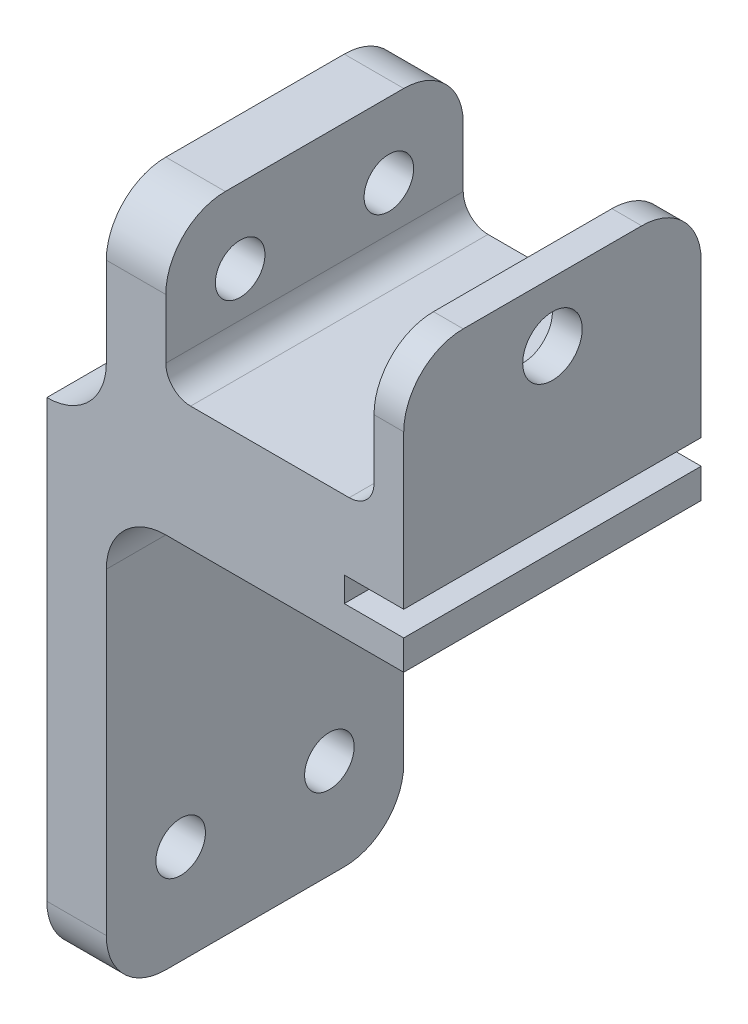
ISO-10303-21;
HEADER;
FILE_DESCRIPTION(('STEP AP214'),'2;1');
FILE_NAME('part.step','',(''),(''),'','','');
FILE_SCHEMA(('AUTOMOTIVE_DESIGN { 1 0 10303 214 1 1 1 1 }'));
ENDSEC;
DATA;
#1=APPLICATION_CONTEXT('core data for automotive mechanical design processes');
#2=APPLICATION_PROTOCOL_DEFINITION('international standard','automotive_design',2000,#1);
#3=PRODUCT_CONTEXT('',#1,'mechanical');
#4=PRODUCT('Part','Part','',(#3));
#5=PRODUCT_RELATED_PRODUCT_CATEGORY('part','',(#4));
#6=PRODUCT_DEFINITION_FORMATION('','',#4);
#7=PRODUCT_DEFINITION_CONTEXT('part definition',#1,'design');
#8=PRODUCT_DEFINITION('design','',#6,#7);
#9=PRODUCT_DEFINITION_SHAPE('','',#8);
#10=(LENGTH_UNIT() NAMED_UNIT(*) SI_UNIT(.MILLI.,.METRE.));
#11=(NAMED_UNIT(*) PLANE_ANGLE_UNIT() SI_UNIT($,.RADIAN.));
#12=(NAMED_UNIT(*) SI_UNIT($,.STERADIAN.) SOLID_ANGLE_UNIT());
#13=UNCERTAINTY_MEASURE_WITH_UNIT(LENGTH_MEASURE(1.E-05),#10,'distance_accuracy_value','');
#14=(GEOMETRIC_REPRESENTATION_CONTEXT(3) GLOBAL_UNCERTAINTY_ASSIGNED_CONTEXT((#13)) GLOBAL_UNIT_ASSIGNED_CONTEXT((#10,
#11,#12)) REPRESENTATION_CONTEXT('',''));
#15=CARTESIAN_POINT('',(0.,0.,0.));
#16=DIRECTION('',(0.,0.,1.));
#17=DIRECTION('',(1.,0.,0.));
#18=AXIS2_PLACEMENT_3D('',#15,#16,#17);
#19=CARTESIAN_POINT('',(0.,-88.,60.));
#20=DIRECTION('',(0.,1.,0.));
#21=DIRECTION('',(0.,0.,1.));
#22=AXIS2_PLACEMENT_3D('',#19,#20,#21);
#23=PLANE('',#22);
#24=DIRECTION('',(0.,0.,-1.));
#25=VECTOR('',#24,1.);
#26=CARTESIAN_POINT('',(-12.,-88.,60.));
#27=LINE('',#26,#25);
#28=CARTESIAN_POINT('',(-12.,-88.,48.));
#29=VERTEX_POINT('',#28);
#30=CARTESIAN_POINT('',(-12.,-88.,12.));
#31=VERTEX_POINT('',#30);
#32=EDGE_CURVE('E280',#29,#31,#27,.T.);
#33=ORIENTED_EDGE('',*,*,#32,.T.);
#34=DIRECTION('',(1.,0.,0.));
#35=VECTOR('',#34,1.);
#36=CARTESIAN_POINT('',(0.,-88.,12.));
#37=LINE('',#36,#35);
#38=CARTESIAN_POINT('',(0.,-88.,12.));
#39=VERTEX_POINT('',#38);
#40=EDGE_CURVE('E403',#31,#39,#37,.T.);
#41=ORIENTED_EDGE('',*,*,#40,.T.);
#42=DIRECTION('',(0.,0.,-1.));
#43=VECTOR('',#42,1.);
#44=CARTESIAN_POINT('',(0.,-88.,60.));
#45=LINE('',#44,#43);
#46=CARTESIAN_POINT('',(0.,-88.,48.));
#47=VERTEX_POINT('',#46);
#48=EDGE_CURVE('E229',#47,#39,#45,.T.);
#49=ORIENTED_EDGE('',*,*,#48,.F.);
#50=DIRECTION('',(1.,0.,0.));
#51=VECTOR('',#50,1.);
#52=CARTESIAN_POINT('',(-12.,-88.,48.));
#53=LINE('',#52,#51);
#54=EDGE_CURVE('E400',#47,#29,#53,.F.);
#55=ORIENTED_EDGE('',*,*,#54,.T.);
#56=EDGE_LOOP('',(#33,#41,#49,#55));
#57=FACE_BOUND('',#56,.T.);
#58=ADVANCED_FACE('F39',(#57),#23,.F.);
#59=CARTESIAN_POINT('',(0.,-12.0000000000001,60.));
#60=DIRECTION('',(-1.,0.,0.));
#61=DIRECTION('',(0.,-1.,0.));
#62=AXIS2_PLACEMENT_3D('',#59,#60,#61);
#63=PLANE('',#62);
#64=CARTESIAN_POINT('',(0.,-68.,45.));
#65=DIRECTION('',(-1.,0.,0.));
#66=DIRECTION('',(0.,-1.,0.));
#67=AXIS2_PLACEMENT_3D('',#64,#65,#66);
#68=CIRCLE('',#67,5.);
#69=CARTESIAN_POINT('',(0.,-73.,45.));
#70=VERTEX_POINT('',#69);
#71=EDGE_CURVE('E823',#70,#70,#68,.F.);
#72=ORIENTED_EDGE('',*,*,#71,.F.);
#73=EDGE_LOOP('',(#72));
#74=FACE_BOUND('',#73,.T.);
#75=CARTESIAN_POINT('',(0.,-68.,15.));
#76=DIRECTION('',(-1.,0.,0.));
#77=DIRECTION('',(0.,-1.,0.));
#78=AXIS2_PLACEMENT_3D('',#75,#76,#77);
#79=CIRCLE('',#78,5.);
#80=CARTESIAN_POINT('',(0.,-73.,15.));
#81=VERTEX_POINT('',#80);
#82=EDGE_CURVE('E284',#81,#81,#79,.F.);
#83=ORIENTED_EDGE('',*,*,#82,.F.);
#84=EDGE_LOOP('',(#83));
#85=FACE_BOUND('',#84,.T.);
#86=ORIENTED_EDGE('',*,*,#48,.T.);
#87=CARTESIAN_POINT('',(0.,-76.,12.));
#88=DIRECTION('',(-1.,0.,0.));
#89=DIRECTION('',(0.,-1.,0.));
#90=AXIS2_PLACEMENT_3D('',#87,#88,#89);
#91=CIRCLE('',#90,12.);
#92=CARTESIAN_POINT('',(0.,-76.,0.));
#93=VERTEX_POINT('',#92);
#94=EDGE_CURVE('E410',#39,#93,#91,.F.);
#95=ORIENTED_EDGE('',*,*,#94,.T.);
#96=DIRECTION('',(0.,1.,0.));
#97=VECTOR('',#96,1.);
#98=CARTESIAN_POINT('',(0.,-12.0000000000001,0.));
#99=LINE('',#98,#97);
#100=CARTESIAN_POINT('',(0.,-12.0000000000001,0.));
#101=VERTEX_POINT('',#100);
#102=EDGE_CURVE('E225',#93,#101,#99,.T.);
#103=ORIENTED_EDGE('',*,*,#102,.T.);
#104=DIRECTION('',(0.,0.,-1.));
#105=VECTOR('',#104,1.);
#106=CARTESIAN_POINT('',(0.,-12.0000000000001,60.));
#107=LINE('',#106,#105);
#108=CARTESIAN_POINT('',(0.,-12.0000000000001,60.));
#109=VERTEX_POINT('',#108);
#110=EDGE_CURVE('E221',#109,#101,#107,.T.);
#111=ORIENTED_EDGE('',*,*,#110,.F.);
#112=DIRECTION('',(0.,1.,0.));
#113=VECTOR('',#112,1.);
#114=CARTESIAN_POINT('',(0.,-12.0000000000001,60.));
#115=LINE('',#114,#113);
#116=CARTESIAN_POINT('',(0.,-76.,60.));
#117=VERTEX_POINT('',#116);
#118=EDGE_CURVE('E207',#117,#109,#115,.T.);
#119=ORIENTED_EDGE('',*,*,#118,.F.);
#120=CARTESIAN_POINT('',(0.,-76.,48.));
#121=DIRECTION('',(-1.,0.,0.));
#122=DIRECTION('',(0.,-1.,0.));
#123=AXIS2_PLACEMENT_3D('',#120,#121,#122);
#124=CIRCLE('',#123,12.);
#125=EDGE_CURVE('E407',#117,#47,#124,.F.);
#126=ORIENTED_EDGE('',*,*,#125,.T.);
#127=EDGE_LOOP('',(#86,#95,#103,#111,#119,#126));
#128=FACE_BOUND('',#127,.T.);
#129=ADVANCED_FACE('F223',(#74,#85,#128),#63,.F.);
#130=CARTESIAN_POINT('',(12.,-12.,60.));
#131=DIRECTION('',(0.,0.,-1.));
#132=DIRECTION('',(-1.,0.,0.));
#133=AXIS2_PLACEMENT_3D('',#130,#131,#132);
#134=CYLINDRICAL_SURFACE('',#133,12.);
#135=CARTESIAN_POINT('',(12.,-12.,0.));
#136=DIRECTION('',(0.,0.,-1.));
#137=DIRECTION('',(-1.,0.,0.));
#138=AXIS2_PLACEMENT_3D('',#135,#136,#137);
#139=CIRCLE('',#138,12.);
#140=CARTESIAN_POINT('',(12.0000000000001,0.,0.));
#141=VERTEX_POINT('',#140);
#142=EDGE_CURVE('E283',#101,#141,#139,.T.);
#143=ORIENTED_EDGE('',*,*,#142,.T.);
#144=DIRECTION('',(0.,0.,-1.));
#145=VECTOR('',#144,1.);
#146=CARTESIAN_POINT('',(12.0000000000001,0.,60.));
#147=LINE('',#146,#145);
#148=CARTESIAN_POINT('',(12.0000000000001,0.,60.));
#149=VERTEX_POINT('',#148);
#150=EDGE_CURVE('E230',#149,#141,#147,.T.);
#151=ORIENTED_EDGE('',*,*,#150,.F.);
#152=CARTESIAN_POINT('',(12.,-12.,60.));
#153=DIRECTION('',(0.,0.,-1.));
#154=DIRECTION('',(-1.,0.,0.));
#155=AXIS2_PLACEMENT_3D('',#152,#153,#154);
#156=CIRCLE('',#155,12.);
#157=EDGE_CURVE('E212',#109,#149,#156,.T.);
#158=ORIENTED_EDGE('',*,*,#157,.F.);
#159=ORIENTED_EDGE('',*,*,#110,.T.);
#160=EDGE_LOOP('',(#143,#151,#158,#159));
#161=FACE_BOUND('',#160,.T.);
#162=ADVANCED_FACE('F232',(#161),#134,.F.);
#163=CARTESIAN_POINT('',(60.,0.,60.));
#164=DIRECTION('',(0.,1.,0.));
#165=DIRECTION('',(0.,0.,1.));
#166=AXIS2_PLACEMENT_3D('',#163,#164,#165);
#167=PLANE('',#166);
#168=DIRECTION('',(1.,0.,0.));
#169=VECTOR('',#168,1.);
#170=CARTESIAN_POINT('',(60.,0.,0.));
#171=LINE('',#170,#169);
#172=CARTESIAN_POINT('',(60.,0.,0.));
#173=VERTEX_POINT('',#172);
#174=EDGE_CURVE('E287',#141,#173,#171,.T.);
#175=ORIENTED_EDGE('',*,*,#174,.T.);
#176=DIRECTION('',(0.,0.,-1.));
#177=VECTOR('',#176,1.);
#178=CARTESIAN_POINT('',(60.,0.,60.));
#179=LINE('',#178,#177);
#180=CARTESIAN_POINT('',(60.,0.,60.));
#181=VERTEX_POINT('',#180);
#182=EDGE_CURVE('E381',#181,#173,#179,.T.);
#183=ORIENTED_EDGE('',*,*,#182,.F.);
#184=DIRECTION('',(1.,0.,0.));
#185=VECTOR('',#184,1.);
#186=CARTESIAN_POINT('',(60.,0.,60.));
#187=LINE('',#186,#185);
#188=EDGE_CURVE('E236',#149,#181,#187,.T.);
#189=ORIENTED_EDGE('',*,*,#188,.F.);
#190=ORIENTED_EDGE('',*,*,#150,.T.);
#191=EDGE_LOOP('',(#175,#183,#189,#190));
#192=FACE_BOUND('',#191,.T.);
#193=ADVANCED_FACE('F512',(#192),#167,.F.);
#194=CARTESIAN_POINT('',(60.,6.,60.));
#195=DIRECTION('',(-1.,0.,0.));
#196=DIRECTION('',(0.,-1.,0.));
#197=AXIS2_PLACEMENT_3D('',#194,#195,#196);
#198=PLANE('',#197);
#199=DIRECTION('',(0.,1.,0.));
#200=VECTOR('',#199,1.);
#201=CARTESIAN_POINT('',(60.,6.,0.));
#202=LINE('',#201,#200);
#203=CARTESIAN_POINT('',(60.,6.,0.));
#204=VERTEX_POINT('',#203);
#205=EDGE_CURVE('E290',#173,#204,#202,.T.);
#206=ORIENTED_EDGE('',*,*,#205,.T.);
#207=DIRECTION('',(0.,0.,-1.));
#208=VECTOR('',#207,1.);
#209=CARTESIAN_POINT('',(60.,6.,60.));
#210=LINE('',#209,#208);
#211=CARTESIAN_POINT('',(60.,6.,60.));
#212=VERTEX_POINT('',#211);
#213=EDGE_CURVE('E377',#212,#204,#210,.T.);
#214=ORIENTED_EDGE('',*,*,#213,.F.);
#215=DIRECTION('',(0.,1.,0.));
#216=VECTOR('',#215,1.);
#217=CARTESIAN_POINT('',(60.,6.,60.));
#218=LINE('',#217,#216);
#219=EDGE_CURVE('E239',#181,#212,#218,.T.);
#220=ORIENTED_EDGE('',*,*,#219,.F.);
#221=ORIENTED_EDGE('',*,*,#182,.T.);
#222=EDGE_LOOP('',(#206,#214,#220,#221));
#223=FACE_BOUND('',#222,.T.);
#224=ADVANCED_FACE('F519',(#223),#198,.F.);
#225=CARTESIAN_POINT('',(48.,6.,60.));
#226=DIRECTION('',(0.,-1.,0.));
#227=DIRECTION('',(0.,0.,-1.));
#228=AXIS2_PLACEMENT_3D('',#225,#226,#227);
#229=PLANE('',#228);
#230=DIRECTION('',(-1.,0.,0.));
#231=VECTOR('',#230,1.);
#232=CARTESIAN_POINT('',(48.,6.,0.));
#233=LINE('',#232,#231);
#234=CARTESIAN_POINT('',(48.,6.,0.));
#235=VERTEX_POINT('',#234);
#236=EDGE_CURVE('E293',#204,#235,#233,.T.);
#237=ORIENTED_EDGE('',*,*,#236,.T.);
#238=DIRECTION('',(0.,0.,-1.));
#239=VECTOR('',#238,1.);
#240=CARTESIAN_POINT('',(48.,6.,60.));
#241=LINE('',#240,#239);
#242=CARTESIAN_POINT('',(48.,6.,60.));
#243=VERTEX_POINT('',#242);
#244=EDGE_CURVE('E373',#243,#235,#241,.T.);
#245=ORIENTED_EDGE('',*,*,#244,.F.);
#246=DIRECTION('',(-1.,0.,0.));
#247=VECTOR('',#246,1.);
#248=CARTESIAN_POINT('',(48.,6.,60.));
#249=LINE('',#248,#247);
#250=EDGE_CURVE('E245',#212,#243,#249,.T.);
#251=ORIENTED_EDGE('',*,*,#250,.F.);
#252=ORIENTED_EDGE('',*,*,#213,.T.);
#253=EDGE_LOOP('',(#237,#245,#251,#252));
#254=FACE_BOUND('',#253,.T.);
#255=ADVANCED_FACE('F522',(#254),#229,.F.);
#256=CARTESIAN_POINT('',(48.,11.,60.));
#257=DIRECTION('',(-1.,0.,0.));
#258=DIRECTION('',(0.,-1.,0.));
#259=AXIS2_PLACEMENT_3D('',#256,#257,#258);
#260=PLANE('',#259);
#261=DIRECTION('',(0.,1.,0.));
#262=VECTOR('',#261,1.);
#263=CARTESIAN_POINT('',(48.,11.,0.));
#264=LINE('',#263,#262);
#265=CARTESIAN_POINT('',(48.,11.,0.));
#266=VERTEX_POINT('',#265);
#267=EDGE_CURVE('E296',#235,#266,#264,.T.);
#268=ORIENTED_EDGE('',*,*,#267,.T.);
#269=DIRECTION('',(0.,0.,-1.));
#270=VECTOR('',#269,1.);
#271=CARTESIAN_POINT('',(48.,11.,60.));
#272=LINE('',#271,#270);
#273=CARTESIAN_POINT('',(48.,11.,60.));
#274=VERTEX_POINT('',#273);
#275=EDGE_CURVE('E369',#274,#266,#272,.T.);
#276=ORIENTED_EDGE('',*,*,#275,.F.);
#277=DIRECTION('',(0.,1.,0.));
#278=VECTOR('',#277,1.);
#279=CARTESIAN_POINT('',(48.,11.,60.));
#280=LINE('',#279,#278);
#281=EDGE_CURVE('E248',#243,#274,#280,.T.);
#282=ORIENTED_EDGE('',*,*,#281,.F.);
#283=ORIENTED_EDGE('',*,*,#244,.T.);
#284=EDGE_LOOP('',(#268,#276,#282,#283));
#285=FACE_BOUND('',#284,.T.);
#286=ADVANCED_FACE('F527',(#285),#260,.F.);
#287=CARTESIAN_POINT('',(60.,11.,60.));
#288=DIRECTION('',(0.,1.,0.));
#289=DIRECTION('',(-1.,0.,0.));
#290=AXIS2_PLACEMENT_3D('',#287,#288,#289);
#291=PLANE('',#290);
#292=DIRECTION('',(1.,0.,0.));
#293=VECTOR('',#292,1.);
#294=CARTESIAN_POINT('',(60.,11.,0.));
#295=LINE('',#294,#293);
#296=CARTESIAN_POINT('',(60.,11.,0.));
#297=VERTEX_POINT('',#296);
#298=EDGE_CURVE('E299',#266,#297,#295,.T.);
#299=ORIENTED_EDGE('',*,*,#298,.T.);
#300=DIRECTION('',(0.,0.,-1.));
#301=VECTOR('',#300,1.);
#302=CARTESIAN_POINT('',(60.,11.,60.));
#303=LINE('',#302,#301);
#304=CARTESIAN_POINT('',(60.,11.,60.));
#305=VERTEX_POINT('',#304);
#306=EDGE_CURVE('E365',#305,#297,#303,.T.);
#307=ORIENTED_EDGE('',*,*,#306,.F.);
#308=DIRECTION('',(1.,0.,0.));
#309=VECTOR('',#308,1.);
#310=CARTESIAN_POINT('',(60.,11.,60.));
#311=LINE('',#310,#309);
#312=EDGE_CURVE('E251',#274,#305,#311,.T.);
#313=ORIENTED_EDGE('',*,*,#312,.F.);
#314=ORIENTED_EDGE('',*,*,#275,.T.);
#315=EDGE_LOOP('',(#299,#307,#313,#314));
#316=FACE_BOUND('',#315,.T.);
#317=ADVANCED_FACE('F533',(#316),#291,.F.);
#318=CARTESIAN_POINT('',(60.,54.,60.));
#319=DIRECTION('',(-1.,0.,0.));
#320=DIRECTION('',(0.,-1.,0.));
#321=AXIS2_PLACEMENT_3D('',#318,#319,#320);
#322=PLANE('',#321);
#323=CARTESIAN_POINT('',(60.,42.,30.));
#324=DIRECTION('',(1.,0.,0.));
#325=DIRECTION('',(0.,1.,0.));
#326=AXIS2_PLACEMENT_3D('',#323,#324,#325);
#327=CIRCLE('',#326,6.);
#328=CARTESIAN_POINT('',(60.,48.,30.));
#329=VERTEX_POINT('',#328);
#330=EDGE_CURVE('E816',#329,#329,#327,.T.);
#331=ORIENTED_EDGE('',*,*,#330,.F.);
#332=EDGE_LOOP('',(#331));
#333=FACE_BOUND('',#332,.T.);
#334=DIRECTION('',(0.,1.,0.));
#335=VECTOR('',#334,1.);
#336=CARTESIAN_POINT('',(60.,54.,0.));
#337=LINE('',#336,#335);
#338=CARTESIAN_POINT('',(60.,42.,0.));
#339=VERTEX_POINT('',#338);
#340=EDGE_CURVE('E302',#297,#339,#337,.T.);
#341=ORIENTED_EDGE('',*,*,#340,.T.);
#342=CARTESIAN_POINT('',(60.,42.,12.));
#343=DIRECTION('',(-1.,0.,0.));
#344=DIRECTION('',(0.,-1.,0.));
#345=AXIS2_PLACEMENT_3D('',#342,#343,#344);
#346=CIRCLE('',#345,12.);
#347=CARTESIAN_POINT('',(60.,54.,12.));
#348=VERTEX_POINT('',#347);
#349=EDGE_CURVE('E454',#339,#348,#346,.F.);
#350=ORIENTED_EDGE('',*,*,#349,.T.);
#351=DIRECTION('',(0.,0.,-1.));
#352=VECTOR('',#351,1.);
#353=CARTESIAN_POINT('',(60.,54.,60.));
#354=LINE('',#353,#352);
#355=CARTESIAN_POINT('',(60.,54.,48.));
#356=VERTEX_POINT('',#355);
#357=EDGE_CURVE('E361',#356,#348,#354,.T.);
#358=ORIENTED_EDGE('',*,*,#357,.F.);
#359=CARTESIAN_POINT('',(60.,42.,48.));
#360=DIRECTION('',(-1.,0.,0.));
#361=DIRECTION('',(0.,-1.,0.));
#362=AXIS2_PLACEMENT_3D('',#359,#360,#361);
#363=CIRCLE('',#362,12.);
#364=CARTESIAN_POINT('',(60.,42.,60.));
#365=VERTEX_POINT('',#364);
#366=EDGE_CURVE('E451',#356,#365,#363,.F.);
#367=ORIENTED_EDGE('',*,*,#366,.T.);
#368=DIRECTION('',(0.,1.,0.));
#369=VECTOR('',#368,1.);
#370=CARTESIAN_POINT('',(60.,54.,60.));
#371=LINE('',#370,#369);
#372=EDGE_CURVE('E254',#305,#365,#371,.T.);
#373=ORIENTED_EDGE('',*,*,#372,.F.);
#374=ORIENTED_EDGE('',*,*,#306,.T.);
#375=EDGE_LOOP('',(#341,#350,#358,#367,#373,#374));
#376=FACE_BOUND('',#375,.T.);
#377=ADVANCED_FACE('F537',(#333,#376),#322,.F.);
#378=CARTESIAN_POINT('',(54.,54.,60.));
#379=DIRECTION('',(0.,-1.,0.));
#380=DIRECTION('',(0.,0.,-1.));
#381=AXIS2_PLACEMENT_3D('',#378,#379,#380);
#382=PLANE('',#381);
#383=ORIENTED_EDGE('',*,*,#357,.T.);
#384=DIRECTION('',(-1.,0.,0.));
#385=VECTOR('',#384,1.);
#386=CARTESIAN_POINT('',(54.,54.,12.));
#387=LINE('',#386,#385);
#388=CARTESIAN_POINT('',(54.,54.,12.));
#389=VERTEX_POINT('',#388);
#390=EDGE_CURVE('E441',#348,#389,#387,.T.);
#391=ORIENTED_EDGE('',*,*,#390,.T.);
#392=DIRECTION('',(0.,0.,-1.));
#393=VECTOR('',#392,1.);
#394=CARTESIAN_POINT('',(54.,54.,60.));
#395=LINE('',#394,#393);
#396=CARTESIAN_POINT('',(54.,54.,48.));
#397=VERTEX_POINT('',#396);
#398=EDGE_CURVE('E357',#397,#389,#395,.T.);
#399=ORIENTED_EDGE('',*,*,#398,.F.);
#400=DIRECTION('',(-1.,0.,0.));
#401=VECTOR('',#400,1.);
#402=CARTESIAN_POINT('',(60.,54.,48.));
#403=LINE('',#402,#401);
#404=EDGE_CURVE('E438',#397,#356,#403,.F.);
#405=ORIENTED_EDGE('',*,*,#404,.T.);
#406=EDGE_LOOP('',(#383,#391,#399,#405));
#407=FACE_BOUND('',#406,.T.);
#408=ADVANCED_FACE('F568',(#407),#382,.F.);
#409=CARTESIAN_POINT('',(54.,30.,60.));
#410=DIRECTION('',(1.,0.,0.));
#411=DIRECTION('',(0.,1.,0.));
#412=AXIS2_PLACEMENT_3D('',#409,#410,#411);
#413=PLANE('',#412);
#414=CARTESIAN_POINT('',(54.,42.,30.));
#415=DIRECTION('',(1.,0.,0.));
#416=DIRECTION('',(0.,1.,0.));
#417=AXIS2_PLACEMENT_3D('',#414,#415,#416);
#418=CIRCLE('',#417,6.);
#419=CARTESIAN_POINT('',(54.,48.,30.));
#420=VERTEX_POINT('',#419);
#421=EDGE_CURVE('E813',#420,#420,#418,.F.);
#422=ORIENTED_EDGE('',*,*,#421,.F.);
#423=EDGE_LOOP('',(#422));
#424=FACE_BOUND('',#423,.T.);
#425=ORIENTED_EDGE('',*,*,#398,.T.);
#426=CARTESIAN_POINT('',(54.,42.,12.));
#427=DIRECTION('',(1.,0.,0.));
#428=DIRECTION('',(0.,1.,0.));
#429=AXIS2_PLACEMENT_3D('',#426,#427,#428);
#430=CIRCLE('',#429,12.);
#431=CARTESIAN_POINT('',(54.,42.,0.));
#432=VERTEX_POINT('',#431);
#433=EDGE_CURVE('E448',#389,#432,#430,.F.);
#434=ORIENTED_EDGE('',*,*,#433,.T.);
#435=DIRECTION('',(0.,-1.,0.));
#436=VECTOR('',#435,1.);
#437=CARTESIAN_POINT('',(54.,30.,0.));
#438=LINE('',#437,#436);
#439=CARTESIAN_POINT('',(54.,30.,0.));
#440=VERTEX_POINT('',#439);
#441=EDGE_CURVE('E306',#432,#440,#438,.T.);
#442=ORIENTED_EDGE('',*,*,#441,.T.);
#443=DIRECTION('',(0.,0.,-1.));
#444=VECTOR('',#443,1.);
#445=CARTESIAN_POINT('',(54.,30.,60.));
#446=LINE('',#445,#444);
#447=CARTESIAN_POINT('',(54.,30.,60.));
#448=VERTEX_POINT('',#447);
#449=EDGE_CURVE('E353',#448,#440,#446,.T.);
#450=ORIENTED_EDGE('',*,*,#449,.F.);
#451=DIRECTION('',(0.,-1.,0.));
#452=VECTOR('',#451,1.);
#453=CARTESIAN_POINT('',(54.,30.,60.));
#454=LINE('',#453,#452);
#455=CARTESIAN_POINT('',(54.,42.,60.));
#456=VERTEX_POINT('',#455);
#457=EDGE_CURVE('E258',#456,#448,#454,.T.);
#458=ORIENTED_EDGE('',*,*,#457,.F.);
#459=CARTESIAN_POINT('',(54.,42.,48.));
#460=DIRECTION('',(1.,0.,0.));
#461=DIRECTION('',(0.,1.,0.));
#462=AXIS2_PLACEMENT_3D('',#459,#460,#461);
#463=CIRCLE('',#462,12.);
#464=EDGE_CURVE('E445',#456,#397,#463,.F.);
#465=ORIENTED_EDGE('',*,*,#464,.T.);
#466=EDGE_LOOP('',(#425,#434,#442,#450,#458,#465));
#467=FACE_BOUND('',#466,.T.);
#468=ADVANCED_FACE('F546',(#424,#467),#413,.F.);
#469=CARTESIAN_POINT('',(49.,30.,60.));
#470=DIRECTION('',(0.,0.,-1.));
#471=DIRECTION('',(-1.,0.,0.));
#472=AXIS2_PLACEMENT_3D('',#469,#470,#471);
#473=CYLINDRICAL_SURFACE('',#472,5.);
#474=CARTESIAN_POINT('',(49.,30.,0.));
#475=DIRECTION('',(0.,0.,-1.));
#476=DIRECTION('',(1.,0.,0.));
#477=AXIS2_PLACEMENT_3D('',#474,#475,#476);
#478=CIRCLE('',#477,5.);
#479=CARTESIAN_POINT('',(49.,25.,0.));
#480=VERTEX_POINT('',#479);
#481=EDGE_CURVE('E309',#440,#480,#478,.T.);
#482=ORIENTED_EDGE('',*,*,#481,.T.);
#483=DIRECTION('',(0.,0.,-1.));
#484=VECTOR('',#483,1.);
#485=CARTESIAN_POINT('',(49.,25.,60.));
#486=LINE('',#485,#484);
#487=CARTESIAN_POINT('',(49.,25.,60.));
#488=VERTEX_POINT('',#487);
#489=EDGE_CURVE('E349',#488,#480,#486,.T.);
#490=ORIENTED_EDGE('',*,*,#489,.F.);
#491=CARTESIAN_POINT('',(49.,30.,60.));
#492=DIRECTION('',(0.,0.,-1.));
#493=DIRECTION('',(1.,0.,0.));
#494=AXIS2_PLACEMENT_3D('',#491,#492,#493);
#495=CIRCLE('',#494,5.);
#496=EDGE_CURVE('E261',#448,#488,#495,.T.);
#497=ORIENTED_EDGE('',*,*,#496,.F.);
#498=ORIENTED_EDGE('',*,*,#449,.T.);
#499=EDGE_LOOP('',(#482,#490,#497,#498));
#500=FACE_BOUND('',#499,.T.);
#501=ADVANCED_FACE('F553',(#500),#473,.F.);
#502=CARTESIAN_POINT('',(17.,25.,60.));
#503=DIRECTION('',(0.,-1.,0.));
#504=DIRECTION('',(1.,0.,0.));
#505=AXIS2_PLACEMENT_3D('',#502,#503,#504);
#506=PLANE('',#505);
#507=DIRECTION('',(-1.,0.,0.));
#508=VECTOR('',#507,1.);
#509=CARTESIAN_POINT('',(17.,25.,0.));
#510=LINE('',#509,#508);
#511=CARTESIAN_POINT('',(17.,25.,0.));
#512=VERTEX_POINT('',#511);
#513=EDGE_CURVE('E312',#480,#512,#510,.T.);
#514=ORIENTED_EDGE('',*,*,#513,.T.);
#515=DIRECTION('',(0.,0.,-1.));
#516=VECTOR('',#515,1.);
#517=CARTESIAN_POINT('',(17.,25.,60.));
#518=LINE('',#517,#516);
#519=CARTESIAN_POINT('',(17.,25.,60.));
#520=VERTEX_POINT('',#519);
#521=EDGE_CURVE('E345',#520,#512,#518,.T.);
#522=ORIENTED_EDGE('',*,*,#521,.F.);
#523=DIRECTION('',(-1.,0.,0.));
#524=VECTOR('',#523,1.);
#525=CARTESIAN_POINT('',(17.,25.,60.));
#526=LINE('',#525,#524);
#527=EDGE_CURVE('E264',#488,#520,#526,.T.);
#528=ORIENTED_EDGE('',*,*,#527,.F.);
#529=ORIENTED_EDGE('',*,*,#489,.T.);
#530=EDGE_LOOP('',(#514,#522,#528,#529));
#531=FACE_BOUND('',#530,.T.);
#532=ADVANCED_FACE('F557',(#531),#506,.F.);
#533=CARTESIAN_POINT('',(17.,30.,60.));
#534=DIRECTION('',(0.,0.,-1.));
#535=DIRECTION('',(-1.,0.,0.));
#536=AXIS2_PLACEMENT_3D('',#533,#534,#535);
#537=CYLINDRICAL_SURFACE('',#536,5.);
#538=CARTESIAN_POINT('',(17.,30.,0.));
#539=DIRECTION('',(0.,0.,-1.));
#540=DIRECTION('',(1.,0.,0.));
#541=AXIS2_PLACEMENT_3D('',#538,#539,#540);
#542=CIRCLE('',#541,5.);
#543=CARTESIAN_POINT('',(12.,30.,0.));
#544=VERTEX_POINT('',#543);
#545=EDGE_CURVE('E315',#512,#544,#542,.T.);
#546=ORIENTED_EDGE('',*,*,#545,.T.);
#547=DIRECTION('',(0.,0.,-1.));
#548=VECTOR('',#547,1.);
#549=CARTESIAN_POINT('',(12.,30.,60.));
#550=LINE('',#549,#548);
#551=CARTESIAN_POINT('',(12.,30.,60.));
#552=VERTEX_POINT('',#551);
#553=EDGE_CURVE('E341',#552,#544,#550,.T.);
#554=ORIENTED_EDGE('',*,*,#553,.F.);
#555=CARTESIAN_POINT('',(17.,30.,60.));
#556=DIRECTION('',(0.,0.,-1.));
#557=DIRECTION('',(1.,0.,0.));
#558=AXIS2_PLACEMENT_3D('',#555,#556,#557);
#559=CIRCLE('',#558,5.);
#560=EDGE_CURVE('E267',#520,#552,#559,.T.);
#561=ORIENTED_EDGE('',*,*,#560,.F.);
#562=ORIENTED_EDGE('',*,*,#521,.T.);
#563=EDGE_LOOP('',(#546,#554,#561,#562));
#564=FACE_BOUND('',#563,.T.);
#565=ADVANCED_FACE('F561',(#564),#537,.F.);
#566=CARTESIAN_POINT('',(12.,54.,60.));
#567=DIRECTION('',(-1.,0.,0.));
#568=DIRECTION('',(0.,-1.,0.));
#569=AXIS2_PLACEMENT_3D('',#566,#567,#568);
#570=PLANE('',#569);
#571=CARTESIAN_POINT('',(12.,39.,15.));
#572=DIRECTION('',(-1.,0.,0.));
#573=DIRECTION('',(0.,-1.,0.));
#574=AXIS2_PLACEMENT_3D('',#571,#572,#573);
#575=CIRCLE('',#574,5.);
#576=CARTESIAN_POINT('',(12.,34.,15.));
#577=VERTEX_POINT('',#576);
#578=EDGE_CURVE('E811',#577,#577,#575,.F.);
#579=ORIENTED_EDGE('',*,*,#578,.F.);
#580=EDGE_LOOP('',(#579));
#581=FACE_BOUND('',#580,.T.);
#582=CARTESIAN_POINT('',(12.,39.,45.));
#583=DIRECTION('',(-1.,0.,0.));
#584=DIRECTION('',(0.,-1.,0.));
#585=AXIS2_PLACEMENT_3D('',#582,#583,#584);
#586=CIRCLE('',#585,5.);
#587=CARTESIAN_POINT('',(12.,34.,45.));
#588=VERTEX_POINT('',#587);
#589=EDGE_CURVE('E803',#588,#588,#586,.F.);
#590=ORIENTED_EDGE('',*,*,#589,.F.);
#591=EDGE_LOOP('',(#590));
#592=FACE_BOUND('',#591,.T.);
#593=DIRECTION('',(0.,1.,0.));
#594=VECTOR('',#593,1.);
#595=CARTESIAN_POINT('',(12.,54.,0.));
#596=LINE('',#595,#594);
#597=CARTESIAN_POINT('',(12.,42.,0.));
#598=VERTEX_POINT('',#597);
#599=EDGE_CURVE('E318',#544,#598,#596,.T.);
#600=ORIENTED_EDGE('',*,*,#599,.T.);
#601=CARTESIAN_POINT('',(12.,42.,12.));
#602=DIRECTION('',(-1.,0.,0.));
#603=DIRECTION('',(0.,-1.,0.));
#604=AXIS2_PLACEMENT_3D('',#601,#602,#603);
#605=CIRCLE('',#604,12.);
#606=CARTESIAN_POINT('',(12.,54.,12.));
#607=VERTEX_POINT('',#606);
#608=EDGE_CURVE('E11',#598,#607,#605,.F.);
#609=ORIENTED_EDGE('',*,*,#608,.T.);
#610=DIRECTION('',(0.,0.,-1.));
#611=VECTOR('',#610,1.);
#612=CARTESIAN_POINT('',(12.,54.,60.));
#613=LINE('',#612,#611);
#614=CARTESIAN_POINT('',(12.,54.,48.));
#615=VERTEX_POINT('',#614);
#616=EDGE_CURVE('E338',#615,#607,#613,.T.);
#617=ORIENTED_EDGE('',*,*,#616,.F.);
#618=CARTESIAN_POINT('',(12.,42.,48.));
#619=DIRECTION('',(-1.,0.,0.));
#620=DIRECTION('',(0.,-1.,0.));
#621=AXIS2_PLACEMENT_3D('',#618,#619,#620);
#622=CIRCLE('',#621,12.);
#623=CARTESIAN_POINT('',(12.,42.,60.));
#624=VERTEX_POINT('',#623);
#625=EDGE_CURVE('E48',#615,#624,#622,.F.);
#626=ORIENTED_EDGE('',*,*,#625,.T.);
#627=DIRECTION('',(0.,1.,0.));
#628=VECTOR('',#627,1.);
#629=CARTESIAN_POINT('',(12.,54.,60.));
#630=LINE('',#629,#628);
#631=EDGE_CURVE('E270',#552,#624,#630,.T.);
#632=ORIENTED_EDGE('',*,*,#631,.F.);
#633=ORIENTED_EDGE('',*,*,#553,.T.);
#634=EDGE_LOOP('',(#600,#609,#617,#626,#632,#633));
#635=FACE_BOUND('',#634,.T.);
#636=ADVANCED_FACE('F471',(#581,#592,#635),#570,.F.);
#637=CARTESIAN_POINT('',(0.,54.,60.));
#638=DIRECTION('',(0.,-1.,0.));
#639=DIRECTION('',(0.,0.,-1.));
#640=AXIS2_PLACEMENT_3D('',#637,#638,#639);
#641=PLANE('',#640);
#642=ORIENTED_EDGE('',*,*,#616,.T.);
#643=DIRECTION('',(-1.,0.,0.));
#644=VECTOR('',#643,1.);
#645=CARTESIAN_POINT('',(0.,54.,12.));
#646=LINE('',#645,#644);
#647=CARTESIAN_POINT('',(0.,54.,12.));
#648=VERTEX_POINT('',#647);
#649=EDGE_CURVE('E459',#607,#648,#646,.T.);
#650=ORIENTED_EDGE('',*,*,#649,.T.);
#651=DIRECTION('',(0.,0.,-1.));
#652=VECTOR('',#651,1.);
#653=CARTESIAN_POINT('',(0.,54.,60.));
#654=LINE('',#653,#652);
#655=CARTESIAN_POINT('',(0.,54.,48.));
#656=VERTEX_POINT('',#655);
#657=EDGE_CURVE('E334',#656,#648,#654,.T.);
#658=ORIENTED_EDGE('',*,*,#657,.F.);
#659=DIRECTION('',(-1.,0.,0.));
#660=VECTOR('',#659,1.);
#661=CARTESIAN_POINT('',(12.,54.,48.));
#662=LINE('',#661,#660);
#663=EDGE_CURVE('E60',#656,#615,#662,.F.);
#664=ORIENTED_EDGE('',*,*,#663,.T.);
#665=EDGE_LOOP('',(#642,#650,#658,#664));
#666=FACE_BOUND('',#665,.T.);
#667=ADVANCED_FACE('F479',(#666),#641,.F.);
#668=CARTESIAN_POINT('',(0.,12.,60.));
#669=DIRECTION('',(1.,0.,0.));
#670=DIRECTION('',(0.,1.,0.));
#671=AXIS2_PLACEMENT_3D('',#668,#669,#670);
#672=PLANE('',#671);
#673=CARTESIAN_POINT('',(0.,39.,15.));
#674=DIRECTION('',(1.,0.,0.));
#675=DIRECTION('',(0.,1.,0.));
#676=AXIS2_PLACEMENT_3D('',#673,#674,#675);
#677=CIRCLE('',#676,5.);
#678=CARTESIAN_POINT('',(0.,44.,15.));
#679=VERTEX_POINT('',#678);
#680=EDGE_CURVE('E806',#679,#679,#677,.F.);
#681=ORIENTED_EDGE('',*,*,#680,.F.);
#682=EDGE_LOOP('',(#681));
#683=FACE_BOUND('',#682,.T.);
#684=CARTESIAN_POINT('',(0.,39.,45.));
#685=DIRECTION('',(1.,0.,0.));
#686=DIRECTION('',(0.,1.,0.));
#687=AXIS2_PLACEMENT_3D('',#684,#685,#686);
#688=CIRCLE('',#687,5.);
#689=CARTESIAN_POINT('',(0.,44.,45.));
#690=VERTEX_POINT('',#689);
#691=EDGE_CURVE('E800',#690,#690,#688,.F.);
#692=ORIENTED_EDGE('',*,*,#691,.F.);
#693=EDGE_LOOP('',(#692));
#694=FACE_BOUND('',#693,.T.);
#695=ORIENTED_EDGE('',*,*,#657,.T.);
#696=CARTESIAN_POINT('',(0.,42.,12.));
#697=DIRECTION('',(1.,0.,0.));
#698=DIRECTION('',(0.,1.,0.));
#699=AXIS2_PLACEMENT_3D('',#696,#697,#698);
#700=CIRCLE('',#699,12.);
#701=CARTESIAN_POINT('',(0.,42.,0.));
#702=VERTEX_POINT('',#701);
#703=EDGE_CURVE('E466',#648,#702,#700,.F.);
#704=ORIENTED_EDGE('',*,*,#703,.T.);
#705=DIRECTION('',(0.,-1.,0.));
#706=VECTOR('',#705,1.);
#707=CARTESIAN_POINT('',(0.,12.,0.));
#708=LINE('',#707,#706);
#709=CARTESIAN_POINT('',(0.,24.,0.));
#710=VERTEX_POINT('',#709);
#711=EDGE_CURVE('E321',#702,#710,#708,.T.);
#712=ORIENTED_EDGE('',*,*,#711,.T.);
#713=DIRECTION('',(0.,0.,-1.));
#714=VECTOR('',#713,1.);
#715=CARTESIAN_POINT('',(0.,24.,60.));
#716=LINE('',#715,#714);
#717=CARTESIAN_POINT('',(0.,24.,60.));
#718=VERTEX_POINT('',#717);
#719=EDGE_CURVE('E389',#710,#718,#716,.F.);
#720=ORIENTED_EDGE('',*,*,#719,.T.);
#721=DIRECTION('',(0.,-1.,0.));
#722=VECTOR('',#721,1.);
#723=CARTESIAN_POINT('',(0.,12.,60.));
#724=LINE('',#723,#722);
#725=CARTESIAN_POINT('',(0.,42.,60.));
#726=VERTEX_POINT('',#725);
#727=EDGE_CURVE('E274',#726,#718,#724,.T.);
#728=ORIENTED_EDGE('',*,*,#727,.F.);
#729=CARTESIAN_POINT('',(0.,42.,48.));
#730=DIRECTION('',(1.,0.,0.));
#731=DIRECTION('',(0.,1.,0.));
#732=AXIS2_PLACEMENT_3D('',#729,#730,#731);
#733=CIRCLE('',#732,12.);
#734=EDGE_CURVE('E463',#726,#656,#733,.F.);
#735=ORIENTED_EDGE('',*,*,#734,.T.);
#736=EDGE_LOOP('',(#695,#704,#712,#720,#728,#735));
#737=FACE_BOUND('',#736,.T.);
#738=ADVANCED_FACE('F478',(#683,#694,#737),#672,.F.);
#739=CARTESIAN_POINT('',(-12.,-88.,60.));
#740=DIRECTION('',(1.,0.,0.));
#741=DIRECTION('',(0.,1.,0.));
#742=AXIS2_PLACEMENT_3D('',#739,#740,#741);
#743=PLANE('',#742);
#744=CARTESIAN_POINT('',(-12.,-68.,45.));
#745=DIRECTION('',(-1.,0.,0.));
#746=DIRECTION('',(0.,-1.,0.));
#747=AXIS2_PLACEMENT_3D('',#744,#745,#746);
#748=CIRCLE('',#747,5.);
#749=CARTESIAN_POINT('',(-12.,-73.,45.));
#750=VERTEX_POINT('',#749);
#751=EDGE_CURVE('E819',#750,#750,#748,.T.);
#752=ORIENTED_EDGE('',*,*,#751,.F.);
#753=EDGE_LOOP('',(#752));
#754=FACE_BOUND('',#753,.T.);
#755=CARTESIAN_POINT('',(-12.,-68.,15.));
#756=DIRECTION('',(-1.,0.,0.));
#757=DIRECTION('',(0.,-1.,0.));
#758=AXIS2_PLACEMENT_3D('',#755,#756,#757);
#759=CIRCLE('',#758,5.);
#760=CARTESIAN_POINT('',(-12.,-73.,15.));
#761=VERTEX_POINT('',#760);
#762=EDGE_CURVE('E827',#761,#761,#759,.T.);
#763=ORIENTED_EDGE('',*,*,#762,.F.);
#764=EDGE_LOOP('',(#763));
#765=FACE_BOUND('',#764,.T.);
#766=DIRECTION('',(0.,-1.,0.));
#767=VECTOR('',#766,1.);
#768=CARTESIAN_POINT('',(-12.,-88.,0.));
#769=LINE('',#768,#767);
#770=CARTESIAN_POINT('',(-12.,12.,0.));
#771=VERTEX_POINT('',#770);
#772=CARTESIAN_POINT('',(-12.,-76.,0.));
#773=VERTEX_POINT('',#772);
#774=EDGE_CURVE('E218',#771,#773,#769,.T.);
#775=ORIENTED_EDGE('',*,*,#774,.T.);
#776=CARTESIAN_POINT('',(-12.,-76.,12.));
#777=DIRECTION('',(1.,0.,0.));
#778=DIRECTION('',(0.,1.,0.));
#779=AXIS2_PLACEMENT_3D('',#776,#777,#778);
#780=CIRCLE('',#779,12.);
#781=EDGE_CURVE('E425',#773,#31,#780,.F.);
#782=ORIENTED_EDGE('',*,*,#781,.T.);
#783=ORIENTED_EDGE('',*,*,#32,.F.);
#784=CARTESIAN_POINT('',(-12.,-76.,48.));
#785=DIRECTION('',(1.,0.,0.));
#786=DIRECTION('',(0.,1.,0.));
#787=AXIS2_PLACEMENT_3D('',#784,#785,#786);
#788=CIRCLE('',#787,12.);
#789=CARTESIAN_POINT('',(-12.,-76.,60.));
#790=VERTEX_POINT('',#789);
#791=EDGE_CURVE('E422',#29,#790,#788,.F.);
#792=ORIENTED_EDGE('',*,*,#791,.T.);
#793=DIRECTION('',(0.,-1.,0.));
#794=VECTOR('',#793,1.);
#795=CARTESIAN_POINT('',(-12.,-88.,60.));
#796=LINE('',#795,#794);
#797=CARTESIAN_POINT('',(-12.,12.,60.));
#798=VERTEX_POINT('',#797);
#799=EDGE_CURVE('E277',#798,#790,#796,.T.);
#800=ORIENTED_EDGE('',*,*,#799,.F.);
#801=DIRECTION('',(0.,0.,-1.));
#802=VECTOR('',#801,1.);
#803=CARTESIAN_POINT('',(-12.,12.,60.));
#804=LINE('',#803,#802);
#805=EDGE_CURVE('E330',#798,#771,#804,.T.);
#806=ORIENTED_EDGE('',*,*,#805,.T.);
#807=EDGE_LOOP('',(#775,#782,#783,#792,#800,#806));
#808=FACE_BOUND('',#807,.T.);
#809=ADVANCED_FACE('F496',(#754,#765,#808),#743,.F.);
#810=CARTESIAN_POINT('',(17.,30.,60.));
#811=DIRECTION('',(0.,0.,1.));
#812=DIRECTION('',(1.,0.,0.));
#813=AXIS2_PLACEMENT_3D('',#810,#811,#812);
#814=PLANE('',#813);
#815=ORIENTED_EDGE('',*,*,#799,.T.);
#816=DIRECTION('',(1.,0.,0.));
#817=VECTOR('',#816,1.);
#818=CARTESIAN_POINT('',(0.,-76.,60.));
#819=LINE('',#818,#817);
#820=EDGE_CURVE('E215',#790,#117,#819,.T.);
#821=ORIENTED_EDGE('',*,*,#820,.T.);
#822=ORIENTED_EDGE('',*,*,#118,.T.);
#823=ORIENTED_EDGE('',*,*,#157,.T.);
#824=ORIENTED_EDGE('',*,*,#188,.T.);
#825=ORIENTED_EDGE('',*,*,#219,.T.);
#826=ORIENTED_EDGE('',*,*,#250,.T.);
#827=ORIENTED_EDGE('',*,*,#281,.T.);
#828=ORIENTED_EDGE('',*,*,#312,.T.);
#829=ORIENTED_EDGE('',*,*,#372,.T.);
#830=DIRECTION('',(-1.,0.,0.));
#831=VECTOR('',#830,1.);
#832=CARTESIAN_POINT('',(54.,42.,60.));
#833=LINE('',#832,#831);
#834=EDGE_CURVE('E432',#365,#456,#833,.T.);
#835=ORIENTED_EDGE('',*,*,#834,.T.);
#836=ORIENTED_EDGE('',*,*,#457,.T.);
#837=ORIENTED_EDGE('',*,*,#496,.T.);
#838=ORIENTED_EDGE('',*,*,#527,.T.);
#839=ORIENTED_EDGE('',*,*,#560,.T.);
#840=ORIENTED_EDGE('',*,*,#631,.T.);
#841=DIRECTION('',(-1.,0.,0.));
#842=VECTOR('',#841,1.);
#843=CARTESIAN_POINT('',(0.,42.,60.));
#844=LINE('',#843,#842);
#845=EDGE_CURVE('E428',#624,#726,#844,.T.);
#846=ORIENTED_EDGE('',*,*,#845,.T.);
#847=ORIENTED_EDGE('',*,*,#727,.T.);
#848=CARTESIAN_POINT('',(-12.,24.,60.));
#849=DIRECTION('',(0.,0.,1.));
#850=DIRECTION('',(1.,0.,0.));
#851=AXIS2_PLACEMENT_3D('',#848,#849,#850);
#852=CIRCLE('',#851,12.);
#853=EDGE_CURVE('E397',#718,#798,#852,.F.);
#854=ORIENTED_EDGE('',*,*,#853,.T.);
#855=EDGE_LOOP('',(#815,#821,#822,#823,#824,#825,#826,#827,#828,#829,#835,#836,#837,#838,#839,
#840,#846,#847,#854));
#856=FACE_BOUND('',#855,.T.);
#857=ADVANCED_FACE('F210',(#856),#814,.T.);
#858=CARTESIAN_POINT('',(17.,30.,0.));
#859=DIRECTION('',(0.,0.,1.));
#860=DIRECTION('',(1.,0.,0.));
#861=AXIS2_PLACEMENT_3D('',#858,#859,#860);
#862=PLANE('',#861);
#863=ORIENTED_EDGE('',*,*,#102,.F.);
#864=DIRECTION('',(1.,0.,0.));
#865=VECTOR('',#864,1.);
#866=CARTESIAN_POINT('',(17.,-76.,0.));
#867=LINE('',#866,#865);
#868=EDGE_CURVE('E419',#93,#773,#867,.F.);
#869=ORIENTED_EDGE('',*,*,#868,.T.);
#870=ORIENTED_EDGE('',*,*,#774,.F.);
#871=CARTESIAN_POINT('',(-12.,24.,0.));
#872=DIRECTION('',(0.,0.,1.));
#873=DIRECTION('',(1.,0.,0.));
#874=AXIS2_PLACEMENT_3D('',#871,#872,#873);
#875=CIRCLE('',#874,12.);
#876=EDGE_CURVE('E393',#771,#710,#875,.T.);
#877=ORIENTED_EDGE('',*,*,#876,.T.);
#878=ORIENTED_EDGE('',*,*,#711,.F.);
#879=DIRECTION('',(-1.,0.,0.));
#880=VECTOR('',#879,1.);
#881=CARTESIAN_POINT('',(17.,42.,0.));
#882=LINE('',#881,#880);
#883=EDGE_CURVE('E413',#702,#598,#882,.F.);
#884=ORIENTED_EDGE('',*,*,#883,.T.);
#885=ORIENTED_EDGE('',*,*,#599,.F.);
#886=ORIENTED_EDGE('',*,*,#545,.F.);
#887=ORIENTED_EDGE('',*,*,#513,.F.);
#888=ORIENTED_EDGE('',*,*,#481,.F.);
#889=ORIENTED_EDGE('',*,*,#441,.F.);
#890=DIRECTION('',(-1.,0.,0.));
#891=VECTOR('',#890,1.);
#892=CARTESIAN_POINT('',(17.,42.,0.));
#893=LINE('',#892,#891);
#894=EDGE_CURVE('E416',#432,#339,#893,.F.);
#895=ORIENTED_EDGE('',*,*,#894,.T.);
#896=ORIENTED_EDGE('',*,*,#340,.F.);
#897=ORIENTED_EDGE('',*,*,#298,.F.);
#898=ORIENTED_EDGE('',*,*,#267,.F.);
#899=ORIENTED_EDGE('',*,*,#236,.F.);
#900=ORIENTED_EDGE('',*,*,#205,.F.);
#901=ORIENTED_EDGE('',*,*,#174,.F.);
#902=ORIENTED_EDGE('',*,*,#142,.F.);
#903=EDGE_LOOP('',(#863,#869,#870,#877,#878,#884,#885,#886,#887,#888,#889,#895,#896,#897,#898,
#899,#900,#901,#902));
#904=FACE_BOUND('',#903,.T.);
#905=ADVANCED_FACE('F486',(#904),#862,.F.);
#906=CARTESIAN_POINT('',(-12.,24.,60.));
#907=DIRECTION('',(0.,0.,1.));
#908=DIRECTION('',(1.,0.,0.));
#909=AXIS2_PLACEMENT_3D('',#906,#907,#908);
#910=CYLINDRICAL_SURFACE('',#909,12.);
#911=ORIENTED_EDGE('',*,*,#853,.F.);
#912=ORIENTED_EDGE('',*,*,#719,.F.);
#913=ORIENTED_EDGE('',*,*,#876,.F.);
#914=ORIENTED_EDGE('',*,*,#805,.F.);
#915=EDGE_LOOP('',(#911,#912,#913,#914));
#916=FACE_BOUND('',#915,.T.);
#917=ADVANCED_FACE('F493',(#916),#910,.F.);
#918=CARTESIAN_POINT('',(0.,-76.,12.));
#919=DIRECTION('',(1.,0.,0.));
#920=DIRECTION('',(0.,0.,-1.));
#921=AXIS2_PLACEMENT_3D('',#918,#919,#920);
#922=CYLINDRICAL_SURFACE('',#921,12.);
#923=ORIENTED_EDGE('',*,*,#781,.F.);
#924=ORIENTED_EDGE('',*,*,#868,.F.);
#925=ORIENTED_EDGE('',*,*,#94,.F.);
#926=ORIENTED_EDGE('',*,*,#40,.F.);
#927=EDGE_LOOP('',(#923,#924,#925,#926));
#928=FACE_BOUND('',#927,.T.);
#929=ADVANCED_FACE('F507',(#928),#922,.T.);
#930=CARTESIAN_POINT('',(17.,-76.,48.));
#931=DIRECTION('',(-1.,0.,0.));
#932=DIRECTION('',(0.,0.,1.));
#933=AXIS2_PLACEMENT_3D('',#930,#931,#932);
#934=CYLINDRICAL_SURFACE('',#933,12.);
#935=ORIENTED_EDGE('',*,*,#791,.F.);
#936=ORIENTED_EDGE('',*,*,#54,.F.);
#937=ORIENTED_EDGE('',*,*,#125,.F.);
#938=ORIENTED_EDGE('',*,*,#820,.F.);
#939=EDGE_LOOP('',(#935,#936,#937,#938));
#940=FACE_BOUND('',#939,.T.);
#941=ADVANCED_FACE('F501',(#940),#934,.T.);
#942=CARTESIAN_POINT('',(54.,42.,12.));
#943=DIRECTION('',(-1.,0.,0.));
#944=DIRECTION('',(0.,0.,1.));
#945=AXIS2_PLACEMENT_3D('',#942,#943,#944);
#946=CYLINDRICAL_SURFACE('',#945,12.);
#947=ORIENTED_EDGE('',*,*,#349,.F.);
#948=ORIENTED_EDGE('',*,*,#894,.F.);
#949=ORIENTED_EDGE('',*,*,#433,.F.);
#950=ORIENTED_EDGE('',*,*,#390,.F.);
#951=EDGE_LOOP('',(#947,#948,#949,#950));
#952=FACE_BOUND('',#951,.T.);
#953=ADVANCED_FACE('F565',(#952),#946,.T.);
#954=CARTESIAN_POINT('',(17.,42.,48.));
#955=DIRECTION('',(1.,0.,0.));
#956=DIRECTION('',(0.,0.,-1.));
#957=AXIS2_PLACEMENT_3D('',#954,#955,#956);
#958=CYLINDRICAL_SURFACE('',#957,12.);
#959=ORIENTED_EDGE('',*,*,#366,.F.);
#960=ORIENTED_EDGE('',*,*,#404,.F.);
#961=ORIENTED_EDGE('',*,*,#464,.F.);
#962=ORIENTED_EDGE('',*,*,#834,.F.);
#963=EDGE_LOOP('',(#959,#960,#961,#962));
#964=FACE_BOUND('',#963,.T.);
#965=ADVANCED_FACE('F542',(#964),#958,.T.);
#966=CARTESIAN_POINT('',(0.,42.,12.));
#967=DIRECTION('',(-1.,0.,0.));
#968=DIRECTION('',(0.,0.,1.));
#969=AXIS2_PLACEMENT_3D('',#966,#967,#968);
#970=CYLINDRICAL_SURFACE('',#969,12.);
#971=ORIENTED_EDGE('',*,*,#608,.F.);
#972=ORIENTED_EDGE('',*,*,#883,.F.);
#973=ORIENTED_EDGE('',*,*,#703,.F.);
#974=ORIENTED_EDGE('',*,*,#649,.F.);
#975=EDGE_LOOP('',(#971,#972,#973,#974));
#976=FACE_BOUND('',#975,.T.);
#977=ADVANCED_FACE('F482',(#976),#970,.T.);
#978=CARTESIAN_POINT('',(17.,42.,48.));
#979=DIRECTION('',(1.,0.,0.));
#980=DIRECTION('',(0.,0.,-1.));
#981=AXIS2_PLACEMENT_3D('',#978,#979,#980);
#982=CYLINDRICAL_SURFACE('',#981,12.);
#983=ORIENTED_EDGE('',*,*,#625,.F.);
#984=ORIENTED_EDGE('',*,*,#663,.F.);
#985=ORIENTED_EDGE('',*,*,#734,.F.);
#986=ORIENTED_EDGE('',*,*,#845,.F.);
#987=EDGE_LOOP('',(#983,#984,#985,#986));
#988=FACE_BOUND('',#987,.T.);
#989=ADVANCED_FACE('F41',(#988),#982,.T.);
#990=CARTESIAN_POINT('',(60.001,-67.9999999999999,15.));
#991=DIRECTION('',(-1.,0.,0.));
#992=DIRECTION('',(0.,-1.,0.));
#993=AXIS2_PLACEMENT_3D('',#990,#991,#992);
#994=CYLINDRICAL_SURFACE('',#993,5.);
#995=ORIENTED_EDGE('',*,*,#762,.T.);
#996=EDGE_LOOP('',(#995));
#997=FACE_BOUND('',#996,.T.);
#998=ORIENTED_EDGE('',*,*,#82,.T.);
#999=EDGE_LOOP('',(#998));
#1000=FACE_BOUND('',#999,.T.);
#1001=ADVANCED_FACE('F601',(#997,#1000),#994,.F.);
#1002=CARTESIAN_POINT('',(60.001,-67.9999999999999,45.));
#1003=DIRECTION('',(-1.,0.,0.));
#1004=DIRECTION('',(0.,-1.,0.));
#1005=AXIS2_PLACEMENT_3D('',#1002,#1003,#1004);
#1006=CYLINDRICAL_SURFACE('',#1005,5.);
#1007=ORIENTED_EDGE('',*,*,#751,.T.);
#1008=EDGE_LOOP('',(#1007));
#1009=FACE_BOUND('',#1008,.T.);
#1010=ORIENTED_EDGE('',*,*,#71,.T.);
#1011=EDGE_LOOP('',(#1010));
#1012=FACE_BOUND('',#1011,.T.);
#1013=ADVANCED_FACE('F605',(#1009,#1012),#1006,.F.);
#1014=CARTESIAN_POINT('',(60.001,39.,45.));
#1015=DIRECTION('',(-1.,0.,0.));
#1016=DIRECTION('',(0.,-1.,0.));
#1017=AXIS2_PLACEMENT_3D('',#1014,#1015,#1016);
#1018=CYLINDRICAL_SURFACE('',#1017,5.);
#1019=ORIENTED_EDGE('',*,*,#691,.T.);
#1020=EDGE_LOOP('',(#1019));
#1021=FACE_BOUND('',#1020,.T.);
#1022=ORIENTED_EDGE('',*,*,#589,.T.);
#1023=EDGE_LOOP('',(#1022));
#1024=FACE_BOUND('',#1023,.T.);
#1025=ADVANCED_FACE('F611',(#1021,#1024),#1018,.F.);
#1026=CARTESIAN_POINT('',(60.001,39.,15.));
#1027=DIRECTION('',(-1.,0.,0.));
#1028=DIRECTION('',(0.,-1.,0.));
#1029=AXIS2_PLACEMENT_3D('',#1026,#1027,#1028);
#1030=CYLINDRICAL_SURFACE('',#1029,5.);
#1031=ORIENTED_EDGE('',*,*,#680,.T.);
#1032=EDGE_LOOP('',(#1031));
#1033=FACE_BOUND('',#1032,.T.);
#1034=ORIENTED_EDGE('',*,*,#578,.T.);
#1035=EDGE_LOOP('',(#1034));
#1036=FACE_BOUND('',#1035,.T.);
#1037=ADVANCED_FACE('F618',(#1033,#1036),#1030,.F.);
#1038=CARTESIAN_POINT('',(-12.001,42.,30.));
#1039=DIRECTION('',(1.,0.,0.));
#1040=DIRECTION('',(0.,1.,0.));
#1041=AXIS2_PLACEMENT_3D('',#1038,#1039,#1040);
#1042=CYLINDRICAL_SURFACE('',#1041,6.);
#1043=ORIENTED_EDGE('',*,*,#330,.T.);
#1044=EDGE_LOOP('',(#1043));
#1045=FACE_BOUND('',#1044,.T.);
#1046=ORIENTED_EDGE('',*,*,#421,.T.);
#1047=EDGE_LOOP('',(#1046));
#1048=FACE_BOUND('',#1047,.T.);
#1049=ADVANCED_FACE('F767',(#1045,#1048),#1042,.F.);
#1050=CLOSED_SHELL('',(#58,#129,#162,#193,#224,#255,#286,#317,#377,#408,#468,#501,#532,#565,
#636,#667,#738,#809,#857,#905,#917,#929,#941,#953,#965,#977,#989,#1001,#1013,#1025,#1037,#1049));
#1051=MANIFOLD_SOLID_BREP('B2',#1050);
#1052=ADVANCED_BREP_SHAPE_REPRESENTATION('',(#18,#1051),#14);
#1053=SHAPE_DEFINITION_REPRESENTATION(#9,#1052);
ENDSEC;
END-ISO-10303-21;
